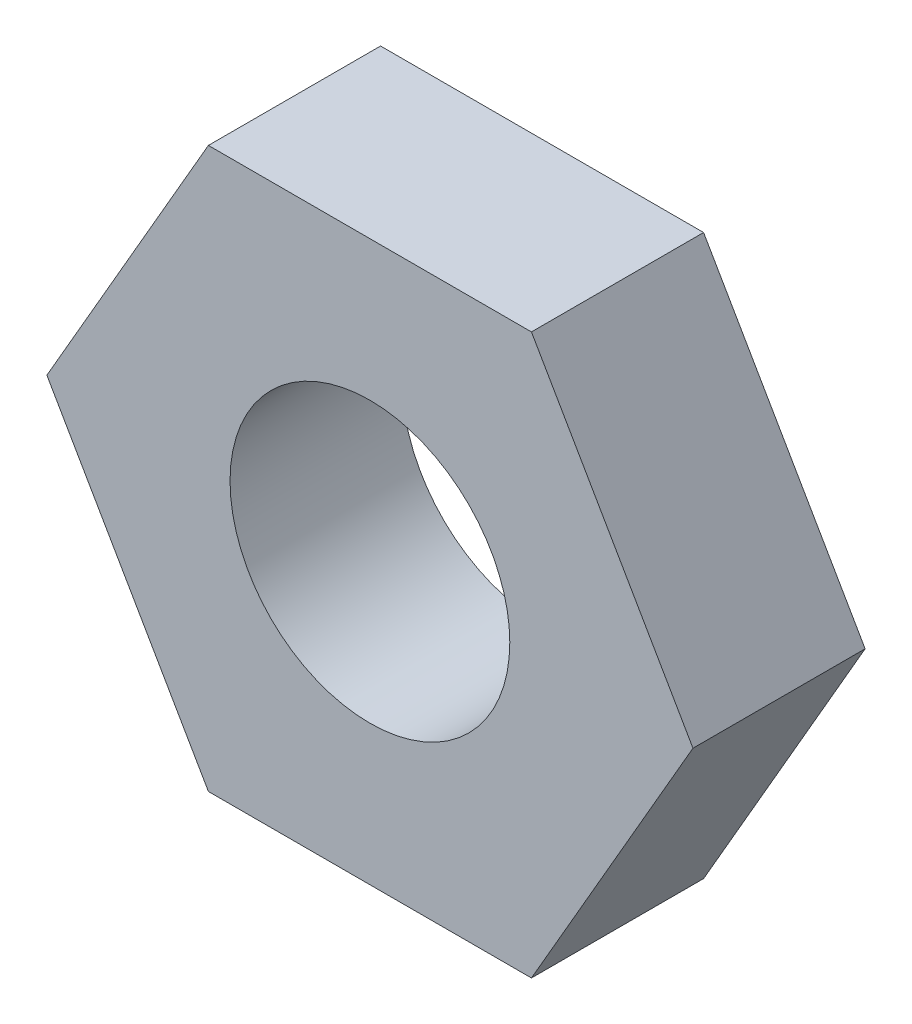
ISO-10303-21;
HEADER;
FILE_DESCRIPTION(('STEP AP214'),'2;1');
FILE_NAME('part.step','',(''),(''),'','','');
FILE_SCHEMA(('AUTOMOTIVE_DESIGN { 1 0 10303 214 1 1 1 1 }'));
ENDSEC;
DATA;
#1=APPLICATION_CONTEXT('core data for automotive mechanical design processes');
#2=APPLICATION_PROTOCOL_DEFINITION('international standard','automotive_design',2000,#1);
#3=PRODUCT_CONTEXT('',#1,'mechanical');
#4=PRODUCT('Part','Part','',(#3));
#5=PRODUCT_RELATED_PRODUCT_CATEGORY('part','',(#4));
#6=PRODUCT_DEFINITION_FORMATION('','',#4);
#7=PRODUCT_DEFINITION_CONTEXT('part definition',#1,'design');
#8=PRODUCT_DEFINITION('design','',#6,#7);
#9=PRODUCT_DEFINITION_SHAPE('','',#8);
#10=(LENGTH_UNIT() NAMED_UNIT(*) SI_UNIT(.MILLI.,.METRE.));
#11=(NAMED_UNIT(*) PLANE_ANGLE_UNIT() SI_UNIT($,.RADIAN.));
#12=(NAMED_UNIT(*) SI_UNIT($,.STERADIAN.) SOLID_ANGLE_UNIT());
#13=UNCERTAINTY_MEASURE_WITH_UNIT(LENGTH_MEASURE(1.E-05),#10,'distance_accuracy_value','');
#14=(GEOMETRIC_REPRESENTATION_CONTEXT(3) GLOBAL_UNCERTAINTY_ASSIGNED_CONTEXT((#13)) GLOBAL_UNIT_ASSIGNED_CONTEXT((#10,
#11,#12)) REPRESENTATION_CONTEXT('',''));
#15=CARTESIAN_POINT('',(0.,0.,0.));
#16=DIRECTION('',(0.,0.,1.));
#17=DIRECTION('',(1.,0.,0.));
#18=AXIS2_PLACEMENT_3D('',#15,#16,#17);
#19=CARTESIAN_POINT('',(7.50555349946513,0.,4.));
#20=DIRECTION('',(-0.866025403784438,-0.5,0.));
#21=DIRECTION('',(-0.5,0.866025403784438,0.));
#22=AXIS2_PLACEMENT_3D('',#19,#20,#21);
#23=PLANE('',#22);
#24=DIRECTION('',(-0.5,0.866025403784438,0.));
#25=VECTOR('',#24,1.);
#26=CARTESIAN_POINT('',(7.50555349946513,0.,0.));
#27=LINE('',#26,#25);
#28=CARTESIAN_POINT('',(7.50555349946513,0.,0.));
#29=VERTEX_POINT('',#28);
#30=CARTESIAN_POINT('',(3.75277674973256,6.5,0.));
#31=VERTEX_POINT('',#30);
#32=EDGE_CURVE('E104',#29,#31,#27,.T.);
#33=ORIENTED_EDGE('',*,*,#32,.T.);
#34=DIRECTION('',(0.,0.,-1.));
#35=VECTOR('',#34,1.);
#36=CARTESIAN_POINT('',(3.75277674973256,6.5,4.));
#37=LINE('',#36,#35);
#38=CARTESIAN_POINT('',(3.75277674973256,6.5,4.));
#39=VERTEX_POINT('',#38);
#40=EDGE_CURVE('E147',#39,#31,#37,.T.);
#41=ORIENTED_EDGE('',*,*,#40,.F.);
#42=DIRECTION('',(-0.5,0.866025403784438,0.));
#43=VECTOR('',#42,1.);
#44=CARTESIAN_POINT('',(7.50555349946513,0.,4.));
#45=LINE('',#44,#43);
#46=CARTESIAN_POINT('',(7.50555349946513,0.,4.));
#47=VERTEX_POINT('',#46);
#48=EDGE_CURVE('E107',#47,#39,#45,.T.);
#49=ORIENTED_EDGE('',*,*,#48,.F.);
#50=DIRECTION('',(0.,0.,-1.));
#51=VECTOR('',#50,1.);
#52=CARTESIAN_POINT('',(7.50555349946513,0.,4.));
#53=LINE('',#52,#51);
#54=EDGE_CURVE('E11',#47,#29,#53,.T.);
#55=ORIENTED_EDGE('',*,*,#54,.T.);
#56=EDGE_LOOP('',(#33,#41,#49,#55));
#57=FACE_BOUND('',#56,.T.);
#58=ADVANCED_FACE('F17',(#57),#23,.F.);
#59=CARTESIAN_POINT('',(3.75277674973256,-6.5,4.));
#60=DIRECTION('',(-0.866025403784438,0.5,0.));
#61=DIRECTION('',(0.,0.,1.));
#62=AXIS2_PLACEMENT_3D('',#59,#60,#61);
#63=PLANE('',#62);
#64=DIRECTION('',(0.5,0.866025403784438,0.));
#65=VECTOR('',#64,1.);
#66=CARTESIAN_POINT('',(3.75277674973256,-6.5,0.));
#67=LINE('',#66,#65);
#68=CARTESIAN_POINT('',(3.75277674973256,-6.5,0.));
#69=VERTEX_POINT('',#68);
#70=EDGE_CURVE('E112',#69,#29,#67,.T.);
#71=ORIENTED_EDGE('',*,*,#70,.T.);
#72=ORIENTED_EDGE('',*,*,#54,.F.);
#73=DIRECTION('',(0.5,0.866025403784438,0.));
#74=VECTOR('',#73,1.);
#75=CARTESIAN_POINT('',(3.75277674973256,-6.5,4.));
#76=LINE('',#75,#74);
#77=CARTESIAN_POINT('',(3.75277674973256,-6.5,4.));
#78=VERTEX_POINT('',#77);
#79=EDGE_CURVE('E138',#78,#47,#76,.T.);
#80=ORIENTED_EDGE('',*,*,#79,.F.);
#81=DIRECTION('',(0.,0.,-1.));
#82=VECTOR('',#81,1.);
#83=CARTESIAN_POINT('',(3.75277674973256,-6.5,4.));
#84=LINE('',#83,#82);
#85=EDGE_CURVE('E27',#78,#69,#84,.T.);
#86=ORIENTED_EDGE('',*,*,#85,.T.);
#87=EDGE_LOOP('',(#71,#72,#80,#86));
#88=FACE_BOUND('',#87,.T.);
#89=ADVANCED_FACE('F113',(#88),#63,.F.);
#90=CARTESIAN_POINT('',(-3.75277674973256,-6.5,4.));
#91=DIRECTION('',(0.,1.,0.));
#92=DIRECTION('',(1.,0.,0.));
#93=AXIS2_PLACEMENT_3D('',#90,#91,#92);
#94=PLANE('',#93);
#95=DIRECTION('',(1.,0.,0.));
#96=VECTOR('',#95,1.);
#97=CARTESIAN_POINT('',(-3.75277674973256,-6.5,0.));
#98=LINE('',#97,#96);
#99=CARTESIAN_POINT('',(-3.75277674973256,-6.5,0.));
#100=VERTEX_POINT('',#99);
#101=EDGE_CURVE('E21',#100,#69,#98,.T.);
#102=ORIENTED_EDGE('',*,*,#101,.T.);
#103=ORIENTED_EDGE('',*,*,#85,.F.);
#104=DIRECTION('',(1.,0.,0.));
#105=VECTOR('',#104,1.);
#106=CARTESIAN_POINT('',(-3.75277674973256,-6.5,4.));
#107=LINE('',#106,#105);
#108=CARTESIAN_POINT('',(-3.75277674973256,-6.5,4.));
#109=VERTEX_POINT('',#108);
#110=EDGE_CURVE('E140',#109,#78,#107,.T.);
#111=ORIENTED_EDGE('',*,*,#110,.F.);
#112=DIRECTION('',(0.,0.,-1.));
#113=VECTOR('',#112,1.);
#114=CARTESIAN_POINT('',(-3.75277674973256,-6.5,4.));
#115=LINE('',#114,#113);
#116=EDGE_CURVE('E52',#109,#100,#115,.T.);
#117=ORIENTED_EDGE('',*,*,#116,.T.);
#118=EDGE_LOOP('',(#102,#103,#111,#117));
#119=FACE_BOUND('',#118,.T.);
#120=ADVANCED_FACE('F248',(#119),#94,.F.);
#121=CARTESIAN_POINT('',(-7.50555349946513,0.,4.));
#122=DIRECTION('',(0.866025403784439,0.5,0.));
#123=DIRECTION('',(0.,0.,-1.));
#124=AXIS2_PLACEMENT_3D('',#121,#122,#123);
#125=PLANE('',#124);
#126=DIRECTION('',(0.5,-0.866025403784439,0.));
#127=VECTOR('',#126,1.);
#128=CARTESIAN_POINT('',(-7.50555349946513,0.,0.));
#129=LINE('',#128,#127);
#130=CARTESIAN_POINT('',(-7.50555349946513,0.,0.));
#131=VERTEX_POINT('',#130);
#132=EDGE_CURVE('E146',#131,#100,#129,.T.);
#133=ORIENTED_EDGE('',*,*,#132,.T.);
#134=ORIENTED_EDGE('',*,*,#116,.F.);
#135=DIRECTION('',(0.5,-0.866025403784439,0.));
#136=VECTOR('',#135,1.);
#137=CARTESIAN_POINT('',(-7.50555349946513,0.,4.));
#138=LINE('',#137,#136);
#139=CARTESIAN_POINT('',(-7.50555349946513,0.,4.));
#140=VERTEX_POINT('',#139);
#141=EDGE_CURVE('E132',#140,#109,#138,.T.);
#142=ORIENTED_EDGE('',*,*,#141,.F.);
#143=DIRECTION('',(0.,0.,-1.));
#144=VECTOR('',#143,1.);
#145=CARTESIAN_POINT('',(-7.50555349946513,0.,4.));
#146=LINE('',#145,#144);
#147=EDGE_CURVE('E41',#140,#131,#146,.T.);
#148=ORIENTED_EDGE('',*,*,#147,.T.);
#149=EDGE_LOOP('',(#133,#134,#142,#148));
#150=FACE_BOUND('',#149,.T.);
#151=ADVANCED_FACE('F263',(#150),#125,.F.);
#152=CARTESIAN_POINT('',(-3.75277674973257,6.5,4.));
#153=DIRECTION('',(0.866025403784439,-0.5,0.));
#154=DIRECTION('',(0.,0.,-1.));
#155=AXIS2_PLACEMENT_3D('',#152,#153,#154);
#156=PLANE('',#155);
#157=DIRECTION('',(-0.5,-0.866025403784439,0.));
#158=VECTOR('',#157,1.);
#159=CARTESIAN_POINT('',(-3.75277674973257,6.5,0.));
#160=LINE('',#159,#158);
#161=CARTESIAN_POINT('',(-3.75277674973257,6.5,0.));
#162=VERTEX_POINT('',#161);
#163=EDGE_CURVE('E142',#162,#131,#160,.T.);
#164=ORIENTED_EDGE('',*,*,#163,.T.);
#165=ORIENTED_EDGE('',*,*,#147,.F.);
#166=DIRECTION('',(-0.5,-0.866025403784439,0.));
#167=VECTOR('',#166,1.);
#168=CARTESIAN_POINT('',(-3.75277674973257,6.5,4.));
#169=LINE('',#168,#167);
#170=CARTESIAN_POINT('',(-3.75277674973257,6.5,4.));
#171=VERTEX_POINT('',#170);
#172=EDGE_CURVE('E136',#171,#140,#169,.T.);
#173=ORIENTED_EDGE('',*,*,#172,.F.);
#174=DIRECTION('',(0.,0.,-1.));
#175=VECTOR('',#174,1.);
#176=CARTESIAN_POINT('',(-3.75277674973257,6.5,4.));
#177=LINE('',#176,#175);
#178=EDGE_CURVE('E145',#171,#162,#177,.T.);
#179=ORIENTED_EDGE('',*,*,#178,.T.);
#180=EDGE_LOOP('',(#164,#165,#173,#179));
#181=FACE_BOUND('',#180,.T.);
#182=ADVANCED_FACE('F180',(#181),#156,.F.);
#183=CARTESIAN_POINT('',(3.75277674973256,6.5,4.));
#184=DIRECTION('',(0.,-1.,0.));
#185=DIRECTION('',(0.,0.,-1.));
#186=AXIS2_PLACEMENT_3D('',#183,#184,#185);
#187=PLANE('',#186);
#188=DIRECTION('',(-1.,0.,0.));
#189=VECTOR('',#188,1.);
#190=CARTESIAN_POINT('',(3.75277674973256,6.5,0.));
#191=LINE('',#190,#189);
#192=EDGE_CURVE('E121',#31,#162,#191,.T.);
#193=ORIENTED_EDGE('',*,*,#192,.T.);
#194=ORIENTED_EDGE('',*,*,#178,.F.);
#195=DIRECTION('',(-1.,0.,0.));
#196=VECTOR('',#195,1.);
#197=CARTESIAN_POINT('',(3.75277674973256,6.5,4.));
#198=LINE('',#197,#196);
#199=EDGE_CURVE('E133',#39,#171,#198,.T.);
#200=ORIENTED_EDGE('',*,*,#199,.F.);
#201=ORIENTED_EDGE('',*,*,#40,.T.);
#202=EDGE_LOOP('',(#193,#194,#200,#201));
#203=FACE_BOUND('',#202,.T.);
#204=ADVANCED_FACE('F177',(#203),#187,.F.);
#205=CARTESIAN_POINT('',(-3.75277674973257,6.5,0.));
#206=DIRECTION('',(0.,0.,1.));
#207=DIRECTION('',(1.,0.,0.));
#208=AXIS2_PLACEMENT_3D('',#205,#206,#207);
#209=PLANE('',#208);
#210=CARTESIAN_POINT('',(0.,0.,0.));
#211=DIRECTION('',(0.,0.,1.));
#212=DIRECTION('',(1.,0.,0.));
#213=AXIS2_PLACEMENT_3D('',#210,#211,#212);
#214=CIRCLE('',#213,3.25);
#215=CARTESIAN_POINT('',(-3.25,0.,0.));
#216=VERTEX_POINT('',#215);
#217=EDGE_CURVE('E137',#216,#216,#214,.T.);
#218=ORIENTED_EDGE('',*,*,#217,.T.);
#219=EDGE_LOOP('',(#218));
#220=FACE_BOUND('',#219,.T.);
#221=ORIENTED_EDGE('',*,*,#192,.F.);
#222=ORIENTED_EDGE('',*,*,#32,.F.);
#223=ORIENTED_EDGE('',*,*,#70,.F.);
#224=ORIENTED_EDGE('',*,*,#101,.F.);
#225=ORIENTED_EDGE('',*,*,#132,.F.);
#226=ORIENTED_EDGE('',*,*,#163,.F.);
#227=EDGE_LOOP('',(#221,#222,#223,#224,#225,#226));
#228=FACE_BOUND('',#227,.T.);
#229=ADVANCED_FACE('F118',(#220,#228),#209,.F.);
#230=CARTESIAN_POINT('',(-3.75277674973257,6.5,4.));
#231=DIRECTION('',(0.,0.,1.));
#232=DIRECTION('',(1.,0.,0.));
#233=AXIS2_PLACEMENT_3D('',#230,#231,#232);
#234=PLANE('',#233);
#235=CARTESIAN_POINT('',(0.,0.,4.));
#236=DIRECTION('',(0.,0.,1.));
#237=DIRECTION('',(1.,0.,0.));
#238=AXIS2_PLACEMENT_3D('',#235,#236,#237);
#239=CIRCLE('',#238,3.25);
#240=CARTESIAN_POINT('',(3.25,0.,4.));
#241=VERTEX_POINT('',#240);
#242=EDGE_CURVE('E156',#241,#241,#239,.T.);
#243=ORIENTED_EDGE('',*,*,#242,.F.);
#244=EDGE_LOOP('',(#243));
#245=FACE_BOUND('',#244,.T.);
#246=ORIENTED_EDGE('',*,*,#199,.T.);
#247=ORIENTED_EDGE('',*,*,#172,.T.);
#248=ORIENTED_EDGE('',*,*,#141,.T.);
#249=ORIENTED_EDGE('',*,*,#110,.T.);
#250=ORIENTED_EDGE('',*,*,#79,.T.);
#251=ORIENTED_EDGE('',*,*,#48,.T.);
#252=EDGE_LOOP('',(#246,#247,#248,#249,#250,#251));
#253=FACE_BOUND('',#252,.T.);
#254=ADVANCED_FACE('F19',(#245,#253),#234,.T.);
#255=CARTESIAN_POINT('',(0.,0.,4.));
#256=DIRECTION('',(0.,0.,-1.));
#257=DIRECTION('',(-1.,0.,0.));
#258=AXIS2_PLACEMENT_3D('',#255,#256,#257);
#259=CYLINDRICAL_SURFACE('',#258,3.25);
#260=ORIENTED_EDGE('',*,*,#217,.F.);
#261=EDGE_LOOP('',(#260));
#262=FACE_BOUND('',#261,.T.);
#263=ORIENTED_EDGE('',*,*,#242,.T.);
#264=EDGE_LOOP('',(#263));
#265=FACE_BOUND('',#264,.T.);
#266=ADVANCED_FACE('F282',(#262,#265),#259,.F.);
#267=CLOSED_SHELL('',(#58,#89,#120,#151,#182,#204,#229,#254,#266));
#268=MANIFOLD_SOLID_BREP('B1',#267);
#269=ADVANCED_BREP_SHAPE_REPRESENTATION('',(#18,#268),#14);
#270=SHAPE_DEFINITION_REPRESENTATION(#9,#269);
ENDSEC;
END-ISO-10303-21;
